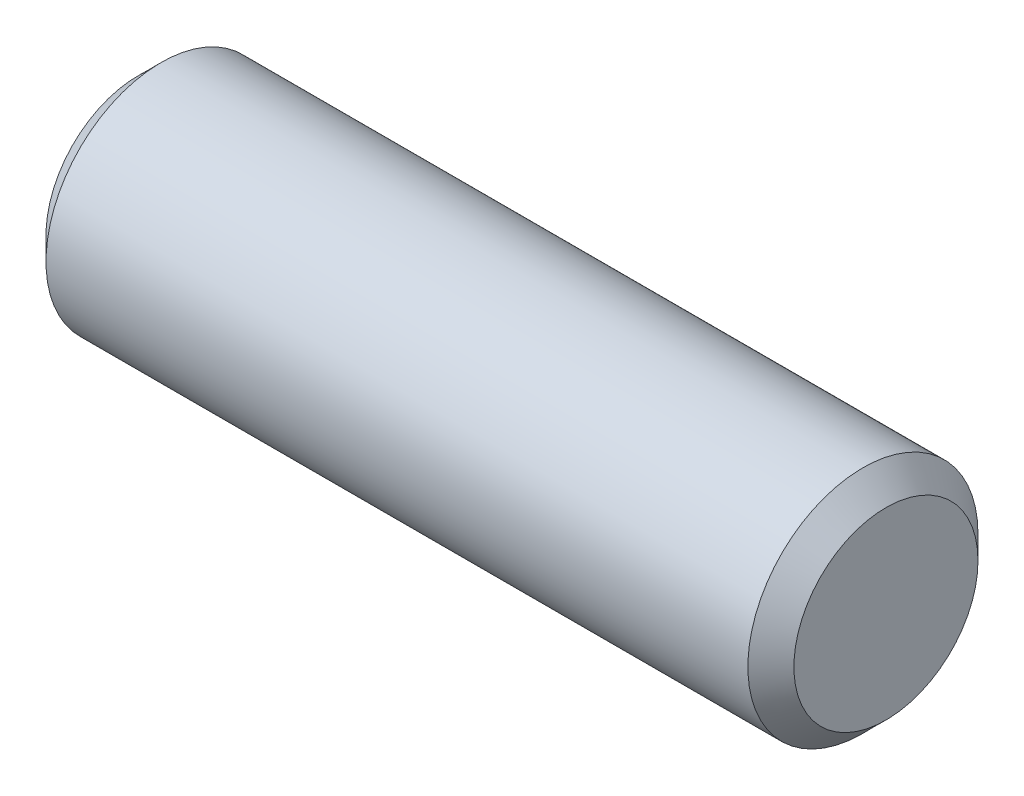
ISO-10303-21;
HEADER;
FILE_DESCRIPTION(('STEP AP214'),'2;1');
FILE_NAME('part.step','',(''),(''),'','','');
FILE_SCHEMA(('AUTOMOTIVE_DESIGN { 1 0 10303 214 1 1 1 1 }'));
ENDSEC;
DATA;
#1=APPLICATION_CONTEXT('core data for automotive mechanical design processes');
#2=APPLICATION_PROTOCOL_DEFINITION('international standard','automotive_design',2000,#1);
#3=PRODUCT_CONTEXT('',#1,'mechanical');
#4=PRODUCT('Part','Part','',(#3));
#5=PRODUCT_RELATED_PRODUCT_CATEGORY('part','',(#4));
#6=PRODUCT_DEFINITION_FORMATION('','',#4);
#7=PRODUCT_DEFINITION_CONTEXT('part definition',#1,'design');
#8=PRODUCT_DEFINITION('design','',#6,#7);
#9=PRODUCT_DEFINITION_SHAPE('','',#8);
#10=(LENGTH_UNIT() NAMED_UNIT(*) SI_UNIT(.MILLI.,.METRE.));
#11=(NAMED_UNIT(*) PLANE_ANGLE_UNIT() SI_UNIT($,.RADIAN.));
#12=(NAMED_UNIT(*) SI_UNIT($,.STERADIAN.) SOLID_ANGLE_UNIT());
#13=UNCERTAINTY_MEASURE_WITH_UNIT(LENGTH_MEASURE(1.E-05),#10,'distance_accuracy_value','');
#14=(GEOMETRIC_REPRESENTATION_CONTEXT(3) GLOBAL_UNCERTAINTY_ASSIGNED_CONTEXT((#13)) GLOBAL_UNIT_ASSIGNED_CONTEXT((#10,
#11,#12)) REPRESENTATION_CONTEXT('',''));
#15=CARTESIAN_POINT('',(0.,0.,0.));
#16=DIRECTION('',(0.,0.,1.));
#17=DIRECTION('',(1.,0.,0.));
#18=AXIS2_PLACEMENT_3D('',#15,#16,#17);
#19=CARTESIAN_POINT('',(-10.31875,0.,0.));
#20=DIRECTION('',(1.,0.,0.));
#21=DIRECTION('',(0.,0.,-1.));
#22=AXIS2_PLACEMENT_3D('',#19,#20,#21);
#23=CYLINDRICAL_SURFACE('',#22,3.175);
#24=CARTESIAN_POINT('',(9.68375,0.,0.));
#25=DIRECTION('',(1.,0.,0.));
#26=DIRECTION('',(0.,0.,-1.));
#27=AXIS2_PLACEMENT_3D('',#24,#25,#26);
#28=CIRCLE('',#27,3.175);
#29=CARTESIAN_POINT('',(9.68375,0.,-3.175));
#30=VERTEX_POINT('',#29);
#31=EDGE_CURVE('E37',#30,#30,#28,.F.);
#32=ORIENTED_EDGE('',*,*,#31,.T.);
#33=EDGE_LOOP('',(#32));
#34=FACE_BOUND('',#33,.T.);
#35=CARTESIAN_POINT('',(-9.68375000000001,0.,0.));
#36=DIRECTION('',(1.,0.,0.));
#37=DIRECTION('',(0.,0.,-1.));
#38=AXIS2_PLACEMENT_3D('',#35,#36,#37);
#39=CIRCLE('',#38,3.175);
#40=CARTESIAN_POINT('',(-9.68375000000001,0.,-3.175));
#41=VERTEX_POINT('',#40);
#42=EDGE_CURVE('E41',#41,#41,#39,.T.);
#43=ORIENTED_EDGE('',*,*,#42,.T.);
#44=EDGE_LOOP('',(#43));
#45=FACE_BOUND('',#44,.T.);
#46=ADVANCED_FACE('F30',(#34,#45),#23,.T.);
#47=CARTESIAN_POINT('',(-10.31875,0.,0.));
#48=DIRECTION('',(1.,0.,0.));
#49=DIRECTION('',(0.,0.,-1.));
#50=AXIS2_PLACEMENT_3D('',#47,#48,#49);
#51=PLANE('',#50);
#52=CARTESIAN_POINT('',(-10.31875,0.,0.));
#53=DIRECTION('',(1.,0.,0.));
#54=DIRECTION('',(0.,0.,-1.));
#55=AXIS2_PLACEMENT_3D('',#52,#53,#54);
#56=CIRCLE('',#55,2.54);
#57=CARTESIAN_POINT('',(-10.31875,0.,-2.54));
#58=VERTEX_POINT('',#57);
#59=EDGE_CURVE('E10',#58,#58,#56,.F.);
#60=ORIENTED_EDGE('',*,*,#59,.T.);
#61=EDGE_LOOP('',(#60));
#62=FACE_BOUND('',#61,.T.);
#63=ADVANCED_FACE('F61',(#62),#51,.F.);
#64=CARTESIAN_POINT('',(10.31875,0.,0.));
#65=DIRECTION('',(1.,0.,0.));
#66=DIRECTION('',(0.,0.,-1.));
#67=AXIS2_PLACEMENT_3D('',#64,#65,#66);
#68=PLANE('',#67);
#69=CARTESIAN_POINT('',(10.31875,0.,0.));
#70=DIRECTION('',(1.,0.,0.));
#71=DIRECTION('',(0.,0.,-1.));
#72=AXIS2_PLACEMENT_3D('',#69,#70,#71);
#73=CIRCLE('',#72,2.54);
#74=CARTESIAN_POINT('',(10.31875,0.,-2.54));
#75=VERTEX_POINT('',#74);
#76=EDGE_CURVE('E45',#75,#75,#73,.T.);
#77=ORIENTED_EDGE('',*,*,#76,.T.);
#78=EDGE_LOOP('',(#77));
#79=FACE_BOUND('',#78,.T.);
#80=ADVANCED_FACE('F51',(#79),#68,.T.);
#81=CARTESIAN_POINT('',(10.31875,0.,0.));
#82=DIRECTION('',(-1.,0.,0.));
#83=DIRECTION('',(0.,0.,1.));
#84=AXIS2_PLACEMENT_3D('',#81,#82,#83);
#85=CONICAL_SURFACE('',#84,2.54,0.785398163397448);
#86=ORIENTED_EDGE('',*,*,#31,.F.);
#87=EDGE_LOOP('',(#86));
#88=FACE_BOUND('',#87,.T.);
#89=ORIENTED_EDGE('',*,*,#76,.F.);
#90=EDGE_LOOP('',(#89));
#91=FACE_BOUND('',#90,.T.);
#92=ADVANCED_FACE('F53',(#88,#91),#85,.T.);
#93=CARTESIAN_POINT('',(-9.68375000000001,0.,0.));
#94=DIRECTION('',(1.,0.,0.));
#95=DIRECTION('',(0.,0.,-1.));
#96=AXIS2_PLACEMENT_3D('',#93,#94,#95);
#97=CONICAL_SURFACE('',#96,3.175,0.785398163397449);
#98=ORIENTED_EDGE('',*,*,#59,.F.);
#99=EDGE_LOOP('',(#98));
#100=FACE_BOUND('',#99,.T.);
#101=ORIENTED_EDGE('',*,*,#42,.F.);
#102=EDGE_LOOP('',(#101));
#103=FACE_BOUND('',#102,.T.);
#104=ADVANCED_FACE('F32',(#100,#103),#97,.T.);
#105=CLOSED_SHELL('',(#46,#63,#80,#92,#104));
#106=MANIFOLD_SOLID_BREP('B2',#105);
#107=ADVANCED_BREP_SHAPE_REPRESENTATION('',(#18,#106),#14);
#108=SHAPE_DEFINITION_REPRESENTATION(#9,#107);
ENDSEC;
END-ISO-10303-21;
